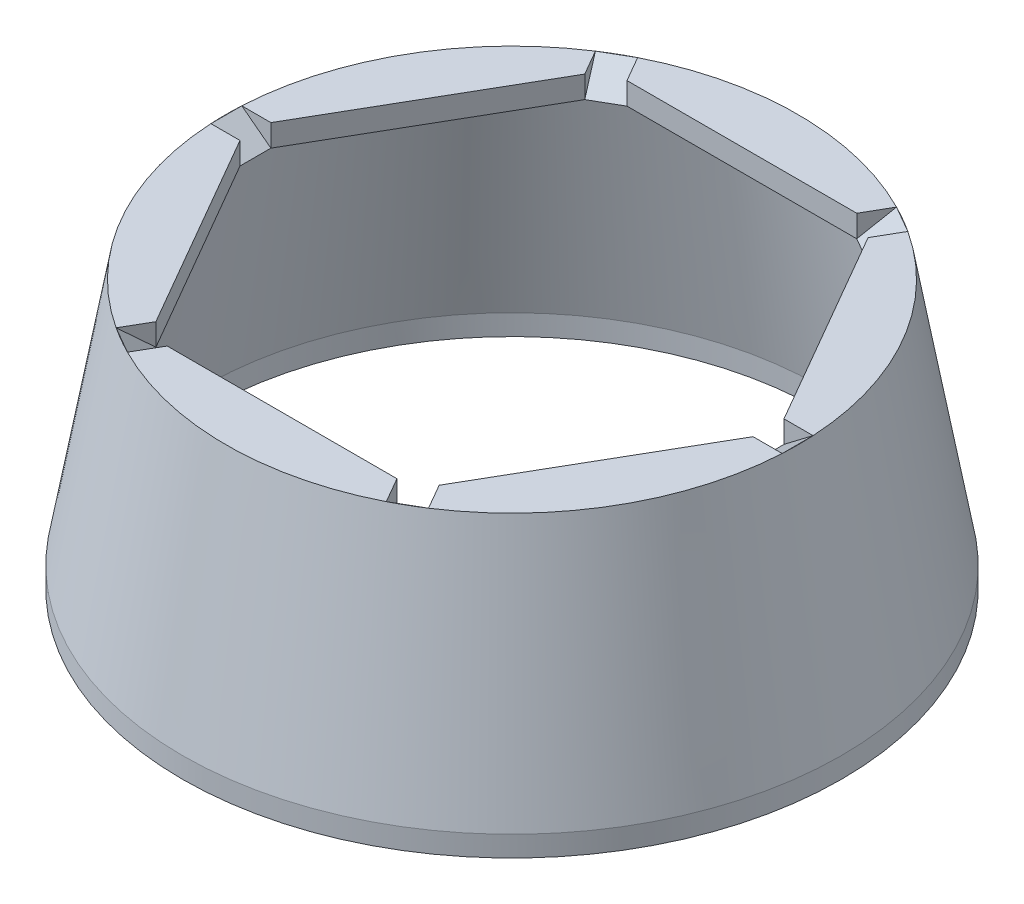
ISO-10303-21;
HEADER;
FILE_DESCRIPTION(('STEP AP214'),'2;1');
FILE_NAME('part.step','',(''),(''),'','','');
FILE_SCHEMA(('AUTOMOTIVE_DESIGN { 1 0 10303 214 1 1 1 1 }'));
ENDSEC;
DATA;
#1=APPLICATION_CONTEXT('core data for automotive mechanical design processes');
#2=APPLICATION_PROTOCOL_DEFINITION('international standard','automotive_design',2000,#1);
#3=PRODUCT_CONTEXT('',#1,'mechanical');
#4=PRODUCT('Part','Part','',(#3));
#5=PRODUCT_RELATED_PRODUCT_CATEGORY('part','',(#4));
#6=PRODUCT_DEFINITION_FORMATION('','',#4);
#7=PRODUCT_DEFINITION_CONTEXT('part definition',#1,'design');
#8=PRODUCT_DEFINITION('design','',#6,#7);
#9=PRODUCT_DEFINITION_SHAPE('','',#8);
#10=(LENGTH_UNIT() NAMED_UNIT(*) SI_UNIT(.MILLI.,.METRE.));
#11=(NAMED_UNIT(*) PLANE_ANGLE_UNIT() SI_UNIT($,.RADIAN.));
#12=(NAMED_UNIT(*) SI_UNIT($,.STERADIAN.) SOLID_ANGLE_UNIT());
#13=UNCERTAINTY_MEASURE_WITH_UNIT(LENGTH_MEASURE(1.E-05),#10,'distance_accuracy_value','');
#14=(GEOMETRIC_REPRESENTATION_CONTEXT(3) GLOBAL_UNCERTAINTY_ASSIGNED_CONTEXT((#13)) GLOBAL_UNIT_ASSIGNED_CONTEXT((#10,
#11,#12)) REPRESENTATION_CONTEXT('',''));
#15=CARTESIAN_POINT('',(0.,0.,0.));
#16=DIRECTION('',(0.,0.,1.));
#17=DIRECTION('',(1.,0.,0.));
#18=AXIS2_PLACEMENT_3D('',#15,#16,#17);
#19=CARTESIAN_POINT('',(0.,650.,0.));
#20=DIRECTION('',(0.,1.,0.));
#21=DIRECTION('',(0.,0.,1.));
#22=AXIS2_PLACEMENT_3D('',#19,#20,#21);
#23=PLANE('',#22);
#24=DIRECTION('',(-0.500000000000168,0.,0.866025403784341));
#25=VECTOR('',#24,1.);
#26=CARTESIAN_POINT('',(314.119157683228,650.,-619.070340738049));
#27=LINE('',#26,#25);
#28=CARTESIAN_POINT('',(314.119157683228,650.,-619.070340738049));
#29=VERTEX_POINT('',#28);
#30=CARTESIAN_POINT('',(278.80063559818,650.,-557.89686603853));
#31=VERTEX_POINT('',#30);
#32=EDGE_CURVE('E522',#29,#31,#27,.T.);
#33=ORIENTED_EDGE('',*,*,#32,.F.);
#34=CARTESIAN_POINT('',(0.,650.,0.));
#35=DIRECTION('',(0.,-1.,0.));
#36=DIRECTION('',(0.,0.,-1.));
#37=AXIS2_PLACEMENT_3D('',#34,#35,#36);
#38=CIRCLE('',#37,694.203811574919);
#39=CARTESIAN_POINT('',(-314.119157683214,650.,-619.070340738056));
#40=VERTEX_POINT('',#39);
#41=EDGE_CURVE('E543',#40,#29,#38,.T.);
#42=ORIENTED_EDGE('',*,*,#41,.F.);
#43=DIRECTION('',(-0.499999999999992,0.,-0.866025403784443));
#44=VECTOR('',#43,1.);
#45=CARTESIAN_POINT('',(-278.800635598174,650.,-557.896866038521));
#46=LINE('',#45,#44);
#47=CARTESIAN_POINT('',(-278.800635598174,650.,-557.896866038521));
#48=VERTEX_POINT('',#47);
#49=EDGE_CURVE('E512',#48,#40,#46,.T.);
#50=ORIENTED_EDGE('',*,*,#49,.F.);
#51=DIRECTION('',(-1.,0.,0.));
#52=VECTOR('',#51,1.);
#53=CARTESIAN_POINT('',(278.800635598174,650.,-557.896866038534));
#54=LINE('',#53,#52);
#55=EDGE_CURVE('E454',#31,#48,#54,.T.);
#56=ORIENTED_EDGE('',*,*,#55,.F.);
#57=EDGE_LOOP('',(#33,#42,#50,#56));
#58=FACE_BOUND('',#57,.T.);
#59=ADVANCED_FACE('F36',(#58),#23,.T.);
#60=DIRECTION('',(-0.866025403784433,0.,-0.50000000000001));
#61=VECTOR('',#60,1.);
#62=CARTESIAN_POINT('',(379.071062967039,650.,-581.570340738061));
#63=LINE('',#62,#61);
#64=CARTESIAN_POINT('',(379.071062967039,650.,-581.570340738061));
#65=VERTEX_POINT('',#64);
#66=EDGE_CURVE('E526',#65,#29,#63,.T.);
#67=ORIENTED_EDGE('',*,*,#66,.F.);
#68=EDGE_CURVE('E538',#29,#65,#38,.T.);
#69=ORIENTED_EDGE('',*,*,#68,.F.);
#70=EDGE_LOOP('',(#67,#69));
#71=FACE_BOUND('',#70,.T.);
#72=ADVANCED_FACE('F269',(#71),#23,.T.);
#73=DIRECTION('',(0.499999999999834,0.,0.866025403784535));
#74=VECTOR('',#73,1.);
#75=CARTESIAN_POINT('',(-379.071062967026,650.,-581.570340738069));
#76=LINE('',#75,#74);
#77=CARTESIAN_POINT('',(-379.071062967026,650.,-581.570340738069));
#78=VERTEX_POINT('',#77);
#79=CARTESIAN_POINT('',(-343.752540882002,650.,-520.396866038537));
#80=VERTEX_POINT('',#79);
#81=EDGE_CURVE('E494',#78,#80,#76,.T.);
#82=ORIENTED_EDGE('',*,*,#81,.F.);
#83=CARTESIAN_POINT('',(-693.190220650253,650.,-37.4999999999885));
#84=VERTEX_POINT('',#83);
#85=EDGE_CURVE('E499',#84,#78,#38,.T.);
#86=ORIENTED_EDGE('',*,*,#85,.F.);
#87=DIRECTION('',(-1.,0.,0.));
#88=VECTOR('',#87,1.);
#89=CARTESIAN_POINT('',(-622.55317648017,650.,-37.4999999999885));
#90=LINE('',#89,#88);
#91=CARTESIAN_POINT('',(-622.55317648017,650.,-37.4999999999885));
#92=VERTEX_POINT('',#91);
#93=EDGE_CURVE('E497',#92,#84,#90,.T.);
#94=ORIENTED_EDGE('',*,*,#93,.F.);
#95=DIRECTION('',(-0.499999999999976,0.,0.866025403784452));
#96=VECTOR('',#95,1.);
#97=CARTESIAN_POINT('',(-343.752540882008,650.,-520.396866038533));
#98=LINE('',#97,#96);
#99=EDGE_CURVE('E199',#80,#92,#98,.T.);
#100=ORIENTED_EDGE('',*,*,#99,.F.);
#101=EDGE_LOOP('',(#82,#86,#94,#100));
#102=FACE_BOUND('',#101,.T.);
#103=ADVANCED_FACE('F274',(#102),#23,.T.);
#104=DIRECTION('',(-0.866025403784443,0.,0.499999999999992));
#105=VECTOR('',#104,1.);
#106=CARTESIAN_POINT('',(-314.119157683214,650.,-619.070340738056));
#107=LINE('',#106,#105);
#108=EDGE_CURVE('E516',#40,#78,#107,.T.);
#109=ORIENTED_EDGE('',*,*,#108,.F.);
#110=EDGE_CURVE('E544',#78,#40,#38,.T.);
#111=ORIENTED_EDGE('',*,*,#110,.F.);
#112=EDGE_LOOP('',(#109,#111));
#113=FACE_BOUND('',#112,.T.);
#114=ADVANCED_FACE('F558',(#113),#23,.T.);
#115=DIRECTION('',(1.,0.,1.82713515449388E-13));
#116=VECTOR('',#115,1.);
#117=CARTESIAN_POINT('',(-693.190220650253,650.,37.4999999999874));
#118=LINE('',#117,#116);
#119=CARTESIAN_POINT('',(-693.190220650253,650.,37.4999999999874));
#120=VERTEX_POINT('',#119);
#121=CARTESIAN_POINT('',(-622.553176480181,650.,37.5000000000003));
#122=VERTEX_POINT('',#121);
#123=EDGE_CURVE('E413',#120,#122,#118,.T.);
#124=ORIENTED_EDGE('',*,*,#123,.F.);
#125=CARTESIAN_POINT('',(-379.071062967036,650.,581.570340738063));
#126=VERTEX_POINT('',#125);
#127=EDGE_CURVE('E411',#126,#120,#38,.T.);
#128=ORIENTED_EDGE('',*,*,#127,.F.);
#129=DIRECTION('',(-0.500000000000004,0.,0.866025403784436));
#130=VECTOR('',#129,1.);
#131=CARTESIAN_POINT('',(-343.752540881994,650.,520.396866038529));
#132=LINE('',#131,#130);
#133=CARTESIAN_POINT('',(-343.752540881994,650.,520.396866038529));
#134=VERTEX_POINT('',#133);
#135=EDGE_CURVE('E173',#134,#126,#132,.T.);
#136=ORIENTED_EDGE('',*,*,#135,.F.);
#137=DIRECTION('',(0.500000000000005,0.,0.866025403784436));
#138=VECTOR('',#137,1.);
#139=CARTESIAN_POINT('',(-622.55317648016,650.,37.4999999999886));
#140=LINE('',#139,#138);
#141=EDGE_CURVE('E193',#122,#134,#140,.T.);
#142=ORIENTED_EDGE('',*,*,#141,.F.);
#143=EDGE_LOOP('',(#124,#128,#136,#142));
#144=FACE_BOUND('',#143,.T.);
#145=ADVANCED_FACE('F412',(#144),#23,.T.);
#146=DIRECTION('',(0.,0.,1.));
#147=VECTOR('',#146,1.);
#148=CARTESIAN_POINT('',(-693.190220650253,650.,-37.4999999999885));
#149=LINE('',#148,#147);
#150=EDGE_CURVE('E501',#84,#120,#149,.T.);
#151=ORIENTED_EDGE('',*,*,#150,.F.);
#152=EDGE_CURVE('E416',#120,#84,#38,.T.);
#153=ORIENTED_EDGE('',*,*,#152,.F.);
#154=EDGE_LOOP('',(#151,#153));
#155=FACE_BOUND('',#154,.T.);
#156=ADVANCED_FACE('F546',(#155),#23,.T.);
#157=DIRECTION('',(0.500000000000162,0.,-0.866025403784345));
#158=VECTOR('',#157,1.);
#159=CARTESIAN_POINT('',(-314.119157683224,650.,619.070340738051));
#160=LINE('',#159,#158);
#161=CARTESIAN_POINT('',(-314.119157683224,650.,619.070340738051));
#162=VERTEX_POINT('',#161);
#163=CARTESIAN_POINT('',(-278.800635598176,650.,557.896866038533));
#164=VERTEX_POINT('',#163);
#165=EDGE_CURVE('E162',#162,#164,#160,.T.);
#166=ORIENTED_EDGE('',*,*,#165,.F.);
#167=CARTESIAN_POINT('',(314.119157683218,650.,619.070340738054));
#168=VERTEX_POINT('',#167);
#169=EDGE_CURVE('E419',#168,#162,#38,.T.);
#170=ORIENTED_EDGE('',*,*,#169,.F.);
#171=DIRECTION('',(0.499999999999998,0.,0.86602540378444));
#172=VECTOR('',#171,1.);
#173=CARTESIAN_POINT('',(278.800635598178,650.,557.896866038519));
#174=LINE('',#173,#172);
#175=CARTESIAN_POINT('',(278.800635598178,650.,557.896866038519));
#176=VERTEX_POINT('',#175);
#177=EDGE_CURVE('E191',#176,#168,#174,.T.);
#178=ORIENTED_EDGE('',*,*,#177,.F.);
#179=DIRECTION('',(1.,0.,0.));
#180=VECTOR('',#179,1.);
#181=CARTESIAN_POINT('',(-278.800635598159,650.,557.89686603851));
#182=LINE('',#181,#180);
#183=EDGE_CURVE('E181',#164,#176,#182,.T.);
#184=ORIENTED_EDGE('',*,*,#183,.F.);
#185=EDGE_LOOP('',(#166,#170,#178,#184));
#186=FACE_BOUND('',#185,.T.);
#187=ADVANCED_FACE('F189',(#186),#23,.T.);
#188=DIRECTION('',(0.866025403784436,0.,0.500000000000004));
#189=VECTOR('',#188,1.);
#190=CARTESIAN_POINT('',(-379.071062967036,650.,581.570340738063));
#191=LINE('',#190,#189);
#192=EDGE_CURVE('E394',#126,#162,#191,.T.);
#193=ORIENTED_EDGE('',*,*,#192,.F.);
#194=EDGE_CURVE('E406',#162,#126,#38,.T.);
#195=ORIENTED_EDGE('',*,*,#194,.F.);
#196=EDGE_LOOP('',(#193,#195));
#197=FACE_BOUND('',#196,.T.);
#198=ADVANCED_FACE('F404',(#197),#23,.T.);
#199=DIRECTION('',(-0.49999999999984,0.,-0.866025403784531));
#200=VECTOR('',#199,1.);
#201=CARTESIAN_POINT('',(379.07106296703,650.,581.570340738066));
#202=LINE('',#201,#200);
#203=CARTESIAN_POINT('',(379.07106296703,650.,581.570340738066));
#204=VERTEX_POINT('',#203);
#205=CARTESIAN_POINT('',(343.752540882006,650.,520.396866038534));
#206=VERTEX_POINT('',#205);
#207=EDGE_CURVE('E431',#204,#206,#202,.T.);
#208=ORIENTED_EDGE('',*,*,#207,.F.);
#209=CARTESIAN_POINT('',(693.190220650253,650.,37.4999999999885));
#210=VERTEX_POINT('',#209);
#211=EDGE_CURVE('E240',#210,#204,#38,.T.);
#212=ORIENTED_EDGE('',*,*,#211,.F.);
#213=DIRECTION('',(1.,0.,0.));
#214=VECTOR('',#213,1.);
#215=CARTESIAN_POINT('',(622.55317648017,650.,37.4999999999885));
#216=LINE('',#215,#214);
#217=CARTESIAN_POINT('',(622.55317648017,650.,37.4999999999885));
#218=VERTEX_POINT('',#217);
#219=EDGE_CURVE('E430',#218,#210,#216,.T.);
#220=ORIENTED_EDGE('',*,*,#219,.F.);
#221=DIRECTION('',(0.499999999999995,0.,-0.866025403784441));
#222=VECTOR('',#221,1.);
#223=CARTESIAN_POINT('',(343.752540882008,650.,520.396866038509));
#224=LINE('',#223,#222);
#225=EDGE_CURVE('E192',#206,#218,#224,.T.);
#226=ORIENTED_EDGE('',*,*,#225,.F.);
#227=EDGE_LOOP('',(#208,#212,#220,#226));
#228=FACE_BOUND('',#227,.T.);
#229=ADVANCED_FACE('F428',(#228),#23,.T.);
#230=DIRECTION('',(0.86602540378444,0.,-0.499999999999998));
#231=VECTOR('',#230,1.);
#232=CARTESIAN_POINT('',(314.119157683218,650.,619.070340738054));
#233=LINE('',#232,#231);
#234=EDGE_CURVE('E436',#168,#204,#233,.T.);
#235=ORIENTED_EDGE('',*,*,#234,.F.);
#236=EDGE_CURVE('E420',#204,#168,#38,.T.);
#237=ORIENTED_EDGE('',*,*,#236,.F.);
#238=EDGE_LOOP('',(#235,#237));
#239=FACE_BOUND('',#238,.T.);
#240=ADVANCED_FACE('F284',(#239),#23,.T.);
#241=DIRECTION('',(0.50000000000001,0.,-0.866025403784433));
#242=VECTOR('',#241,1.);
#243=CARTESIAN_POINT('',(343.752540881998,650.,-520.396866038526));
#244=LINE('',#243,#242);
#245=CARTESIAN_POINT('',(343.752540881998,650.,-520.396866038526));
#246=VERTEX_POINT('',#245);
#247=EDGE_CURVE('E524',#246,#65,#244,.T.);
#248=ORIENTED_EDGE('',*,*,#247,.F.);
#249=DIRECTION('',(-0.5,0.,-0.866025403784439));
#250=VECTOR('',#249,1.);
#251=CARTESIAN_POINT('',(622.553176480181,650.,-37.5000000000003));
#252=LINE('',#251,#250);
#253=CARTESIAN_POINT('',(622.553176480181,650.,-37.5000000000003));
#254=VERTEX_POINT('',#253);
#255=EDGE_CURVE('E196',#254,#246,#252,.T.);
#256=ORIENTED_EDGE('',*,*,#255,.F.);
#257=DIRECTION('',(-1.,0.,-1.82713515449388E-13));
#258=VECTOR('',#257,1.);
#259=CARTESIAN_POINT('',(693.190220650253,650.,-37.4999999999874));
#260=LINE('',#259,#258);
#261=CARTESIAN_POINT('',(693.190220650253,650.,-37.4999999999874));
#262=VERTEX_POINT('',#261);
#263=EDGE_CURVE('E444',#262,#254,#260,.T.);
#264=ORIENTED_EDGE('',*,*,#263,.F.);
#265=EDGE_CURVE('E235',#65,#262,#38,.T.);
#266=ORIENTED_EDGE('',*,*,#265,.F.);
#267=EDGE_LOOP('',(#248,#256,#264,#266));
#268=FACE_BOUND('',#267,.T.);
#269=ADVANCED_FACE('F264',(#268),#23,.T.);
#270=CARTESIAN_POINT('',(0.,650.,0.));
#271=DIRECTION('',(0.,-1.,0.));
#272=DIRECTION('',(0.,0.,-1.));
#273=AXIS2_PLACEMENT_3D('',#270,#271,#272);
#274=CONICAL_SURFACE('',#273,644.203811574919,0.174532925199437);
#275=CARTESIAN_POINT('',(0.,50.,0.));
#276=DIRECTION('',(0.,-1.,0.));
#277=DIRECTION('',(0.,0.,-1.));
#278=AXIS2_PLACEMENT_3D('',#275,#276,#277);
#279=CIRCLE('',#278,750.);
#280=CARTESIAN_POINT('',(0.,50.,-750.));
#281=VERTEX_POINT('',#280);
#282=EDGE_CURVE('E232',#281,#281,#279,.T.);
#283=ORIENTED_EDGE('',*,*,#282,.T.);
#284=EDGE_LOOP('',(#283));
#285=FACE_BOUND('',#284,.T.);
#286=CARTESIAN_POINT('',(0.,596.305798,0.));
#287=DIRECTION('',(0.,1.,0.));
#288=DIRECTION('',(0.,0.,1.));
#289=AXIS2_PLACEMENT_3D('',#286,#287,#288);
#290=CIRCLE('',#289,653.671548095129);
#291=CARTESIAN_POINT('',(0.,596.305798,653.671548095129));
#292=VERTEX_POINT('',#291);
#293=EDGE_CURVE('E40',#292,#292,#290,.T.);
#294=ORIENTED_EDGE('',*,*,#293,.T.);
#295=EDGE_LOOP('',(#294));
#296=FACE_BOUND('',#295,.T.);
#297=ADVANCED_FACE('F249',(#285,#296),#274,.F.);
#298=CARTESIAN_POINT('',(0.,0.,0.));
#299=DIRECTION('',(0.,1.,0.));
#300=DIRECTION('',(0.,0.,1.));
#301=AXIS2_PLACEMENT_3D('',#298,#299,#300);
#302=PLANE('',#301);
#303=CARTESIAN_POINT('',(0.,0.,0.));
#304=DIRECTION('',(0.,1.,0.));
#305=DIRECTION('',(0.,0.,1.));
#306=AXIS2_PLACEMENT_3D('',#303,#304,#305);
#307=CIRCLE('',#306,800.);
#308=CARTESIAN_POINT('',(0.,0.,800.));
#309=VERTEX_POINT('',#308);
#310=EDGE_CURVE('E45',#309,#309,#307,.T.);
#311=ORIENTED_EDGE('',*,*,#310,.F.);
#312=EDGE_LOOP('',(#311));
#313=FACE_BOUND('',#312,.T.);
#314=CARTESIAN_POINT('',(0.,0.,0.));
#315=DIRECTION('',(0.,1.,0.));
#316=DIRECTION('',(0.,0.,1.));
#317=AXIS2_PLACEMENT_3D('',#314,#315,#316);
#318=CIRCLE('',#317,750.);
#319=CARTESIAN_POINT('',(0.,0.,750.));
#320=VERTEX_POINT('',#319);
#321=EDGE_CURVE('E239',#320,#320,#318,.T.);
#322=ORIENTED_EDGE('',*,*,#321,.T.);
#323=EDGE_LOOP('',(#322));
#324=FACE_BOUND('',#323,.T.);
#325=ADVANCED_FACE('F246',(#313,#324),#302,.F.);
#326=CARTESIAN_POINT('',(0.,50.,0.));
#327=DIRECTION('',(0.,-1.,0.));
#328=DIRECTION('',(0.,0.,-1.));
#329=AXIS2_PLACEMENT_3D('',#326,#327,#328);
#330=CYLINDRICAL_SURFACE('',#329,800.);
#331=CARTESIAN_POINT('',(0.,50.,0.));
#332=DIRECTION('',(0.,1.,0.));
#333=DIRECTION('',(0.,0.,1.));
#334=AXIS2_PLACEMENT_3D('',#331,#332,#333);
#335=CIRCLE('',#334,800.);
#336=CARTESIAN_POINT('',(0.,50.,800.));
#337=VERTEX_POINT('',#336);
#338=EDGE_CURVE('E11',#337,#337,#335,.T.);
#339=ORIENTED_EDGE('',*,*,#338,.F.);
#340=EDGE_LOOP('',(#339));
#341=FACE_BOUND('',#340,.T.);
#342=ORIENTED_EDGE('',*,*,#310,.T.);
#343=EDGE_LOOP('',(#342));
#344=FACE_BOUND('',#343,.T.);
#345=ADVANCED_FACE('F38',(#341,#344),#330,.T.);
#346=CARTESIAN_POINT('',(0.,50.,0.));
#347=DIRECTION('',(0.,-1.,0.));
#348=DIRECTION('',(0.,0.,-1.));
#349=AXIS2_PLACEMENT_3D('',#346,#347,#348);
#350=CYLINDRICAL_SURFACE('',#349,750.);
#351=ORIENTED_EDGE('',*,*,#282,.F.);
#352=EDGE_LOOP('',(#351));
#353=FACE_BOUND('',#352,.T.);
#354=ORIENTED_EDGE('',*,*,#321,.F.);
#355=EDGE_LOOP('',(#354));
#356=FACE_BOUND('',#355,.T.);
#357=ADVANCED_FACE('F252',(#353,#356),#350,.F.);
#358=DIRECTION('',(0.,0.,-1.));
#359=VECTOR('',#358,1.);
#360=CARTESIAN_POINT('',(693.190220650253,650.,37.4999999999885));
#361=LINE('',#360,#359);
#362=EDGE_CURVE('E448',#210,#262,#361,.T.);
#363=ORIENTED_EDGE('',*,*,#362,.F.);
#364=EDGE_CURVE('E236',#262,#210,#38,.T.);
#365=ORIENTED_EDGE('',*,*,#364,.F.);
#366=EDGE_LOOP('',(#363,#365));
#367=FACE_BOUND('',#366,.T.);
#368=ADVANCED_FACE('F254',(#367),#23,.T.);
#369=CARTESIAN_POINT('',(0.,50.,0.));
#370=DIRECTION('',(0.,-1.,0.));
#371=DIRECTION('',(0.,0.,-1.));
#372=AXIS2_PLACEMENT_3D('',#369,#370,#371);
#373=CONICAL_SURFACE('',#372,800.,0.174532925199437);
#374=ORIENTED_EDGE('',*,*,#364,.T.);
#375=ORIENTED_EDGE('',*,*,#211,.T.);
#376=ORIENTED_EDGE('',*,*,#236,.T.);
#377=ORIENTED_EDGE('',*,*,#169,.T.);
#378=ORIENTED_EDGE('',*,*,#194,.T.);
#379=ORIENTED_EDGE('',*,*,#127,.T.);
#380=ORIENTED_EDGE('',*,*,#152,.T.);
#381=ORIENTED_EDGE('',*,*,#85,.T.);
#382=ORIENTED_EDGE('',*,*,#110,.T.);
#383=ORIENTED_EDGE('',*,*,#41,.T.);
#384=ORIENTED_EDGE('',*,*,#68,.T.);
#385=ORIENTED_EDGE('',*,*,#265,.T.);
#386=EDGE_LOOP('',(#374,#375,#376,#377,#378,#379,#380,#381,#382,#383,#384,#385));
#387=FACE_BOUND('',#386,.T.);
#388=ORIENTED_EDGE('',*,*,#338,.T.);
#389=EDGE_LOOP('',(#388));
#390=FACE_BOUND('',#389,.T.);
#391=ADVANCED_FACE('F261',(#387,#390),#373,.T.);
#392=CARTESIAN_POINT('',(0.,596.305798,0.));
#393=DIRECTION('',(0.,1.,0.));
#394=DIRECTION('',(0.,0.,1.));
#395=AXIS2_PLACEMENT_3D('',#392,#393,#394);
#396=PLANE('',#395);
#397=DIRECTION('',(-0.866025403784439,0.,-0.499999999999999));
#398=VECTOR('',#397,1.);
#399=CARTESIAN_POINT('',(278.800635598174,596.305798,-557.896866038534));
#400=LINE('',#399,#398);
#401=CARTESIAN_POINT('',(343.752540882007,596.305798,-520.396866038533));
#402=VERTEX_POINT('',#401);
#403=CARTESIAN_POINT('',(278.800635598191,596.305798132989,-557.896866038524));
#404=VERTEX_POINT('',#403);
#405=EDGE_CURVE('E231',#402,#404,#400,.T.);
#406=ORIENTED_EDGE('',*,*,#405,.T.);
#407=DIRECTION('',(-1.,0.,0.));
#408=VECTOR('',#407,1.);
#409=CARTESIAN_POINT('',(278.800635598174,596.305798,-557.896866038534));
#410=LINE('',#409,#408);
#411=CARTESIAN_POINT('',(-278.800635598158,596.305798,-557.89686603853));
#412=VERTEX_POINT('',#411);
#413=EDGE_CURVE('E205',#404,#412,#410,.T.);
#414=ORIENTED_EDGE('',*,*,#413,.T.);
#415=DIRECTION('',(-0.866025403784509,0.,0.499999999999878));
#416=VECTOR('',#415,1.);
#417=CARTESIAN_POINT('',(-343.752540882008,596.305798,-520.396866038533));
#418=LINE('',#417,#416);
#419=CARTESIAN_POINT('',(-343.752540881991,596.305798132989,-520.396866038543));
#420=VERTEX_POINT('',#419);
#421=EDGE_CURVE('E458',#412,#420,#418,.T.);
#422=ORIENTED_EDGE('',*,*,#421,.T.);
#423=DIRECTION('',(-0.499999999999976,0.,0.866025403784452));
#424=VECTOR('',#423,1.);
#425=CARTESIAN_POINT('',(-343.752540882008,596.305798,-520.396866038533));
#426=LINE('',#425,#424);
#427=CARTESIAN_POINT('',(-622.553176480156,596.305798,-37.5000000000125));
#428=VERTEX_POINT('',#427);
#429=EDGE_CURVE('E461',#420,#428,#426,.T.);
#430=ORIENTED_EDGE('',*,*,#429,.T.);
#431=DIRECTION('',(0.,0.,1.));
#432=VECTOR('',#431,1.);
#433=CARTESIAN_POINT('',(-622.55317648016,596.305798,37.4999999999886));
#434=LINE('',#433,#432);
#435=CARTESIAN_POINT('',(-622.553176480158,596.305798132972,37.4999999999874));
#436=VERTEX_POINT('',#435);
#437=EDGE_CURVE('E464',#428,#436,#434,.T.);
#438=ORIENTED_EDGE('',*,*,#437,.T.);
#439=DIRECTION('',(0.500000000000005,0.,0.866025403784436));
#440=VECTOR('',#439,1.);
#441=CARTESIAN_POINT('',(-622.55317648016,596.305798,37.4999999999886));
#442=LINE('',#441,#440);
#443=CARTESIAN_POINT('',(-343.752540881992,596.305798,520.396866038506));
#444=VERTEX_POINT('',#443);
#445=EDGE_CURVE('E467',#436,#444,#442,.T.);
#446=ORIENTED_EDGE('',*,*,#445,.T.);
#447=DIRECTION('',(0.866025403784416,0.,0.50000000000004));
#448=VECTOR('',#447,1.);
#449=CARTESIAN_POINT('',(-278.800635598159,596.305798,557.89686603851));
#450=LINE('',#449,#448);
#451=CARTESIAN_POINT('',(-278.800635598173,596.305798132968,557.896866038502));
#452=VERTEX_POINT('',#451);
#453=EDGE_CURVE('E395',#444,#452,#450,.T.);
#454=ORIENTED_EDGE('',*,*,#453,.T.);
#455=DIRECTION('',(1.,0.,0.));
#456=VECTOR('',#455,1.);
#457=CARTESIAN_POINT('',(-278.800635598159,596.305798,557.89686603851));
#458=LINE('',#457,#456);
#459=CARTESIAN_POINT('',(278.800635598172,596.305798,557.896866038507));
#460=VERTEX_POINT('',#459);
#461=EDGE_CURVE('E183',#452,#460,#458,.T.);
#462=ORIENTED_EDGE('',*,*,#461,.T.);
#463=DIRECTION('',(0.866025403784462,0.,-0.49999999999996));
#464=VECTOR('',#463,1.);
#465=CARTESIAN_POINT('',(343.752540882008,596.305798,520.396866038509));
#466=LINE('',#465,#464);
#467=CARTESIAN_POINT('',(343.752540881984,596.305798132974,520.396866038522));
#468=VERTEX_POINT('',#467);
#469=EDGE_CURVE('E472',#460,#468,#466,.T.);
#470=ORIENTED_EDGE('',*,*,#469,.T.);
#471=DIRECTION('',(0.499999999999995,0.,-0.866025403784441));
#472=VECTOR('',#471,1.);
#473=CARTESIAN_POINT('',(343.752540882008,596.305798,520.396866038509));
#474=LINE('',#473,#472);
#475=CARTESIAN_POINT('',(622.55317648017,596.305798,37.4999999999885));
#476=VERTEX_POINT('',#475);
#477=EDGE_CURVE('E475',#468,#476,#474,.T.);
#478=ORIENTED_EDGE('',*,*,#477,.T.);
#479=DIRECTION('',(1.40628249785874E-13,0.,-1.));
#480=VECTOR('',#479,1.);
#481=CARTESIAN_POINT('',(622.553176480181,596.305798,-37.5000000000003));
#482=LINE('',#481,#480);
#483=CARTESIAN_POINT('',(622.553176480176,596.305798132986,-37.4999999999874));
#484=VERTEX_POINT('',#483);
#485=EDGE_CURVE('E478',#476,#484,#482,.T.);
#486=ORIENTED_EDGE('',*,*,#485,.T.);
#487=DIRECTION('',(-0.5,0.,-0.866025403784439));
#488=VECTOR('',#487,1.);
#489=CARTESIAN_POINT('',(622.553176480181,596.305798,-37.5000000000003));
#490=LINE('',#489,#488);
#491=EDGE_CURVE('E481',#484,#402,#490,.T.);
#492=ORIENTED_EDGE('',*,*,#491,.T.);
#493=EDGE_LOOP('',(#406,#414,#422,#430,#438,#446,#454,#462,#470,#478,#486,#492));
#494=FACE_BOUND('',#493,.T.);
#495=ORIENTED_EDGE('',*,*,#293,.F.);
#496=EDGE_LOOP('',(#495));
#497=FACE_BOUND('',#496,.T.);
#498=ADVANCED_FACE('F290',(#494,#497),#396,.F.);
#499=CARTESIAN_POINT('',(278.800635598174,596.305798,-557.896866038534));
#500=DIRECTION('',(0.,0.,-1.));
#501=DIRECTION('',(-1.,0.,0.));
#502=AXIS2_PLACEMENT_3D('',#499,#500,#501);
#503=PLANE('',#502);
#504=ORIENTED_EDGE('',*,*,#55,.T.);
#505=DIRECTION('',(0.,1.,0.));
#506=VECTOR('',#505,1.);
#507=CARTESIAN_POINT('',(-278.800635598158,596.305798,-557.89686603853));
#508=LINE('',#507,#506);
#509=EDGE_CURVE('E229',#412,#48,#508,.T.);
#510=ORIENTED_EDGE('',*,*,#509,.F.);
#511=ORIENTED_EDGE('',*,*,#413,.F.);
#512=DIRECTION('',(0.,1.,0.));
#513=VECTOR('',#512,1.);
#514=CARTESIAN_POINT('',(278.800635598174,596.305798,-557.896866038534));
#515=LINE('',#514,#513);
#516=EDGE_CURVE('E206',#404,#31,#515,.T.);
#517=ORIENTED_EDGE('',*,*,#516,.T.);
#518=EDGE_LOOP('',(#504,#510,#511,#517));
#519=FACE_BOUND('',#518,.T.);
#520=ADVANCED_FACE('F292',(#519),#503,.F.);
#521=CARTESIAN_POINT('',(622.553176480181,596.305798,-37.5000000000003));
#522=DIRECTION('',(0.866025403784439,0.,-0.5));
#523=DIRECTION('',(-0.5,0.,-0.866025403784439));
#524=AXIS2_PLACEMENT_3D('',#521,#522,#523);
#525=PLANE('',#524);
#526=ORIENTED_EDGE('',*,*,#255,.T.);
#527=DIRECTION('',(0.,1.,0.));
#528=VECTOR('',#527,1.);
#529=CARTESIAN_POINT('',(343.752540882007,596.305798,-520.396866038533));
#530=LINE('',#529,#528);
#531=EDGE_CURVE('E209',#402,#246,#530,.T.);
#532=ORIENTED_EDGE('',*,*,#531,.F.);
#533=ORIENTED_EDGE('',*,*,#491,.F.);
#534=DIRECTION('',(0.,1.,0.));
#535=VECTOR('',#534,1.);
#536=CARTESIAN_POINT('',(622.553176480181,596.305798,-37.5000000000003));
#537=LINE('',#536,#535);
#538=EDGE_CURVE('E211',#484,#254,#537,.T.);
#539=ORIENTED_EDGE('',*,*,#538,.T.);
#540=EDGE_LOOP('',(#526,#532,#533,#539));
#541=FACE_BOUND('',#540,.T.);
#542=ADVANCED_FACE('F298',(#541),#525,.F.);
#543=CARTESIAN_POINT('',(343.752540882008,596.305798,520.396866038509));
#544=DIRECTION('',(0.866025403784441,0.,0.499999999999995));
#545=DIRECTION('',(0.499999999999995,0.,-0.866025403784441));
#546=AXIS2_PLACEMENT_3D('',#543,#544,#545);
#547=PLANE('',#546);
#548=ORIENTED_EDGE('',*,*,#225,.T.);
#549=DIRECTION('',(0.,1.,0.));
#550=VECTOR('',#549,1.);
#551=CARTESIAN_POINT('',(622.55317648017,596.305798,37.4999999999885));
#552=LINE('',#551,#550);
#553=EDGE_CURVE('E214',#476,#218,#552,.T.);
#554=ORIENTED_EDGE('',*,*,#553,.F.);
#555=ORIENTED_EDGE('',*,*,#477,.F.);
#556=DIRECTION('',(0.,1.,0.));
#557=VECTOR('',#556,1.);
#558=CARTESIAN_POINT('',(343.752540882008,596.305798,520.396866038509));
#559=LINE('',#558,#557);
#560=EDGE_CURVE('E216',#468,#206,#559,.T.);
#561=ORIENTED_EDGE('',*,*,#560,.T.);
#562=EDGE_LOOP('',(#548,#554,#555,#561));
#563=FACE_BOUND('',#562,.T.);
#564=ADVANCED_FACE('F315',(#563),#547,.F.);
#565=CARTESIAN_POINT('',(-278.800635598159,596.305798,557.89686603851));
#566=DIRECTION('',(0.,0.,1.));
#567=DIRECTION('',(1.,0.,0.));
#568=AXIS2_PLACEMENT_3D('',#565,#566,#567);
#569=PLANE('',#568);
#570=ORIENTED_EDGE('',*,*,#183,.T.);
#571=DIRECTION('',(0.,1.,0.));
#572=VECTOR('',#571,1.);
#573=CARTESIAN_POINT('',(278.800635598172,596.305798,557.896866038507));
#574=LINE('',#573,#572);
#575=EDGE_CURVE('E185',#460,#176,#574,.T.);
#576=ORIENTED_EDGE('',*,*,#575,.F.);
#577=ORIENTED_EDGE('',*,*,#461,.F.);
#578=DIRECTION('',(0.,1.,0.));
#579=VECTOR('',#578,1.);
#580=CARTESIAN_POINT('',(-278.800635598159,596.305798,557.89686603851));
#581=LINE('',#580,#579);
#582=EDGE_CURVE('E165',#452,#164,#581,.T.);
#583=ORIENTED_EDGE('',*,*,#582,.T.);
#584=EDGE_LOOP('',(#570,#576,#577,#583));
#585=FACE_BOUND('',#584,.T.);
#586=ADVANCED_FACE('F179',(#585),#569,.F.);
#587=CARTESIAN_POINT('',(-622.55317648016,596.305798,37.4999999999886));
#588=DIRECTION('',(-0.866025403784436,0.,0.500000000000005));
#589=DIRECTION('',(0.500000000000005,0.,0.866025403784436));
#590=AXIS2_PLACEMENT_3D('',#587,#588,#589);
#591=PLANE('',#590);
#592=ORIENTED_EDGE('',*,*,#141,.T.);
#593=DIRECTION('',(0.,1.,0.));
#594=VECTOR('',#593,1.);
#595=CARTESIAN_POINT('',(-343.752540881992,596.305798,520.396866038506));
#596=LINE('',#595,#594);
#597=EDGE_CURVE('E186',#444,#134,#596,.T.);
#598=ORIENTED_EDGE('',*,*,#597,.F.);
#599=ORIENTED_EDGE('',*,*,#445,.F.);
#600=DIRECTION('',(0.,1.,0.));
#601=VECTOR('',#600,1.);
#602=CARTESIAN_POINT('',(-622.55317648016,596.305798,37.4999999999886));
#603=LINE('',#602,#601);
#604=EDGE_CURVE('E221',#436,#122,#603,.T.);
#605=ORIENTED_EDGE('',*,*,#604,.T.);
#606=EDGE_LOOP('',(#592,#598,#599,#605));
#607=FACE_BOUND('',#606,.T.);
#608=ADVANCED_FACE('F308',(#607),#591,.F.);
#609=CARTESIAN_POINT('',(-343.752540882008,596.305798,-520.396866038533));
#610=DIRECTION('',(-0.866025403784453,0.,-0.499999999999976));
#611=DIRECTION('',(-0.499999999999976,0.,0.866025403784453));
#612=AXIS2_PLACEMENT_3D('',#609,#610,#611);
#613=PLANE('',#612);
#614=ORIENTED_EDGE('',*,*,#99,.T.);
#615=DIRECTION('',(0.,1.,0.));
#616=VECTOR('',#615,1.);
#617=CARTESIAN_POINT('',(-622.553176480156,596.305798,-37.5000000000125));
#618=LINE('',#617,#616);
#619=EDGE_CURVE('E224',#428,#92,#618,.T.);
#620=ORIENTED_EDGE('',*,*,#619,.F.);
#621=ORIENTED_EDGE('',*,*,#429,.F.);
#622=DIRECTION('',(0.,1.,0.));
#623=VECTOR('',#622,1.);
#624=CARTESIAN_POINT('',(-343.752540882008,596.305798,-520.396866038533));
#625=LINE('',#624,#623);
#626=EDGE_CURVE('E226',#420,#80,#625,.T.);
#627=ORIENTED_EDGE('',*,*,#626,.T.);
#628=EDGE_LOOP('',(#614,#620,#621,#627));
#629=FACE_BOUND('',#628,.T.);
#630=ADVANCED_FACE('F304',(#629),#613,.F.);
#631=CARTESIAN_POINT('',(589.696228211971,571.329843465359,-37.4999999999874));
#632=DIRECTION('',(1.82713515449388E-13,-2.4036752968661E-13,-1.));
#633=DIRECTION('',(0.,1.,-2.4036752968661E-13));
#634=AXIS2_PLACEMENT_3D('',#631,#632,#633);
#635=PLANE('',#634);
#636=DIRECTION('',(0.796107634140624,0.605155050266473,0.));
#637=VECTOR('',#636,1.);
#638=CARTESIAN_POINT('',(589.696228211971,571.329843465359,-37.4999999999874));
#639=LINE('',#638,#637);
#640=EDGE_CURVE('E451',#484,#262,#639,.T.);
#641=ORIENTED_EDGE('',*,*,#640,.T.);
#642=ORIENTED_EDGE('',*,*,#263,.T.);
#643=ORIENTED_EDGE('',*,*,#538,.F.);
#644=EDGE_LOOP('',(#641,#642,#643));
#645=FACE_BOUND('',#644,.T.);
#646=ADVANCED_FACE('F307',(#645),#635,.F.);
#647=CARTESIAN_POINT('',(589.696228211971,571.329843465359,37.4999999999885));
#648=DIRECTION('',(0.605155050266473,-0.796107634140624,0.));
#649=DIRECTION('',(0.796107634140625,0.605155050266473,0.));
#650=AXIS2_PLACEMENT_3D('',#647,#648,#649);
#651=PLANE('',#650);
#652=DIRECTION('',(0.796107634140624,0.605155050266473,0.));
#653=VECTOR('',#652,1.);
#654=CARTESIAN_POINT('',(589.696228211971,571.329843465359,37.4999999999885));
#655=LINE('',#654,#653);
#656=EDGE_CURVE('E61',#476,#210,#655,.T.);
#657=ORIENTED_EDGE('',*,*,#656,.T.);
#658=ORIENTED_EDGE('',*,*,#362,.T.);
#659=ORIENTED_EDGE('',*,*,#640,.F.);
#660=ORIENTED_EDGE('',*,*,#485,.F.);
#661=EDGE_LOOP('',(#657,#658,#659,#660));
#662=FACE_BOUND('',#661,.T.);
#663=ADVANCED_FACE('F324',(#662),#651,.F.);
#664=CARTESIAN_POINT('',(519.059184041889,571.329843465359,37.4999999999885));
#665=DIRECTION('',(0.,0.,1.));
#666=DIRECTION('',(1.,0.,0.));
#667=AXIS2_PLACEMENT_3D('',#664,#665,#666);
#668=PLANE('',#667);
#669=ORIENTED_EDGE('',*,*,#219,.T.);
#670=ORIENTED_EDGE('',*,*,#656,.F.);
#671=ORIENTED_EDGE('',*,*,#553,.T.);
#672=EDGE_LOOP('',(#669,#670,#671));
#673=FACE_BOUND('',#672,.T.);
#674=ADVANCED_FACE('F326',(#673),#668,.F.);
#675=CARTESIAN_POINT('',(-327.324066747887,571.329843465359,-491.941914147442));
#676=DIRECTION('',(-0.866025403784535,-2.40439648467229E-13,0.499999999999834));
#677=DIRECTION('',(0.499999999999834,0.,0.866025403784535));
#678=AXIS2_PLACEMENT_3D('',#675,#676,#677);
#679=PLANE('',#678);
#680=DIRECTION('',(-0.398053817070306,0.605155050266473,-0.689449435312512));
#681=VECTOR('',#680,1.);
#682=CARTESIAN_POINT('',(-327.324066747887,571.329843465359,-491.941914147442));
#683=LINE('',#682,#681);
#684=EDGE_CURVE('E506',#420,#78,#683,.T.);
#685=ORIENTED_EDGE('',*,*,#684,.T.);
#686=ORIENTED_EDGE('',*,*,#81,.T.);
#687=ORIENTED_EDGE('',*,*,#626,.F.);
#688=EDGE_LOOP('',(#685,#686,#687));
#689=FACE_BOUND('',#688,.T.);
#690=ADVANCED_FACE('F329',(#689),#679,.F.);
#691=CARTESIAN_POINT('',(-262.372161464074,571.329843465359,-529.44191414743));
#692=DIRECTION('',(-0.302577525133232,-0.796107634140624,-0.524079646759218));
#693=DIRECTION('',(0.,0.549854184036211,-0.835260663684022));
#694=AXIS2_PLACEMENT_3D('',#691,#692,#693);
#695=PLANE('',#694);
#696=DIRECTION('',(-0.398053817070306,0.605155050266473,-0.689449435312512));
#697=VECTOR('',#696,1.);
#698=CARTESIAN_POINT('',(-262.372161464074,571.329843465359,-529.44191414743));
#699=LINE('',#698,#697);
#700=EDGE_CURVE('E519',#412,#40,#699,.T.);
#701=ORIENTED_EDGE('',*,*,#700,.T.);
#702=ORIENTED_EDGE('',*,*,#108,.T.);
#703=ORIENTED_EDGE('',*,*,#684,.F.);
#704=ORIENTED_EDGE('',*,*,#421,.F.);
#705=EDGE_LOOP('',(#701,#702,#703,#704));
#706=FACE_BOUND('',#705,.T.);
#707=ADVANCED_FACE('F359',(#706),#695,.F.);
#708=CARTESIAN_POINT('',(-227.053639379034,571.329843465359,-468.268439447895));
#709=DIRECTION('',(0.866025403784443,0.,-0.499999999999992));
#710=DIRECTION('',(-0.499999999999992,0.,-0.866025403784443));
#711=AXIS2_PLACEMENT_3D('',#708,#709,#710);
#712=PLANE('',#711);
#713=ORIENTED_EDGE('',*,*,#49,.T.);
#714=ORIENTED_EDGE('',*,*,#700,.F.);
#715=ORIENTED_EDGE('',*,*,#509,.T.);
#716=EDGE_LOOP('',(#713,#714,#715));
#717=FACE_BOUND('',#716,.T.);
#718=ADVANCED_FACE('F361',(#717),#712,.F.);
#719=CARTESIAN_POINT('',(-589.696228211971,571.329843465359,37.4999999999874));
#720=DIRECTION('',(-1.82713515449388E-13,-2.4036752968661E-13,1.));
#721=DIRECTION('',(0.,-1.,-2.4036752968661E-13));
#722=AXIS2_PLACEMENT_3D('',#719,#720,#721);
#723=PLANE('',#722);
#724=DIRECTION('',(-0.796107634140624,0.605155050266473,0.));
#725=VECTOR('',#724,1.);
#726=CARTESIAN_POINT('',(-589.696228211971,571.329843465359,37.4999999999874));
#727=LINE('',#726,#725);
#728=EDGE_CURVE('E174',#436,#120,#727,.T.);
#729=ORIENTED_EDGE('',*,*,#728,.T.);
#730=ORIENTED_EDGE('',*,*,#123,.T.);
#731=ORIENTED_EDGE('',*,*,#604,.F.);
#732=EDGE_LOOP('',(#729,#730,#731));
#733=FACE_BOUND('',#732,.T.);
#734=ADVANCED_FACE('F364',(#733),#723,.F.);
#735=CARTESIAN_POINT('',(-589.696228211971,571.329843465359,-37.4999999999885));
#736=DIRECTION('',(-0.605155050266473,-0.796107634140624,0.));
#737=DIRECTION('',(0.796107634140625,-0.605155050266473,0.));
#738=AXIS2_PLACEMENT_3D('',#735,#736,#737);
#739=PLANE('',#738);
#740=DIRECTION('',(-0.796107634140624,0.605155050266473,0.));
#741=VECTOR('',#740,1.);
#742=CARTESIAN_POINT('',(-589.696228211971,571.329843465359,-37.4999999999885));
#743=LINE('',#742,#741);
#744=EDGE_CURVE('E504',#428,#84,#743,.T.);
#745=ORIENTED_EDGE('',*,*,#744,.T.);
#746=ORIENTED_EDGE('',*,*,#150,.T.);
#747=ORIENTED_EDGE('',*,*,#728,.F.);
#748=ORIENTED_EDGE('',*,*,#437,.F.);
#749=EDGE_LOOP('',(#745,#746,#747,#748));
#750=FACE_BOUND('',#749,.T.);
#751=ADVANCED_FACE('F371',(#750),#739,.F.);
#752=CARTESIAN_POINT('',(-519.059184041889,571.329843465359,-37.4999999999885));
#753=DIRECTION('',(0.,0.,-1.));
#754=DIRECTION('',(-1.,0.,0.));
#755=AXIS2_PLACEMENT_3D('',#752,#753,#754);
#756=PLANE('',#755);
#757=ORIENTED_EDGE('',*,*,#93,.T.);
#758=ORIENTED_EDGE('',*,*,#744,.F.);
#759=ORIENTED_EDGE('',*,*,#619,.T.);
#760=EDGE_LOOP('',(#757,#758,#759));
#761=FACE_BOUND('',#760,.T.);
#762=ADVANCED_FACE('F373',(#761),#756,.F.);
#763=CARTESIAN_POINT('',(-262.372161464083,571.329843465359,529.441914147426));
#764=DIRECTION('',(0.866025403784345,-2.40527850832771E-13,0.500000000000162));
#765=DIRECTION('',(0.500000000000162,0.,-0.866025403784345));
#766=AXIS2_PLACEMENT_3D('',#763,#764,#765);
#767=PLANE('',#766);
#768=DIRECTION('',(-0.398053817070315,0.605155050266473,0.689449435312507));
#769=VECTOR('',#768,1.);
#770=CARTESIAN_POINT('',(-262.372161464083,571.329843465359,529.441914147426));
#771=LINE('',#770,#769);
#772=EDGE_CURVE('E167',#452,#162,#771,.T.);
#773=ORIENTED_EDGE('',*,*,#772,.T.);
#774=ORIENTED_EDGE('',*,*,#165,.T.);
#775=ORIENTED_EDGE('',*,*,#582,.F.);
#776=EDGE_LOOP('',(#773,#774,#775));
#777=FACE_BOUND('',#776,.T.);
#778=ADVANCED_FACE('F164',(#777),#767,.F.);
#779=CARTESIAN_POINT('',(-327.324066747895,571.329843465359,491.941914147437));
#780=DIRECTION('',(-0.302577525133239,-0.796107634140624,0.524079646759213));
#781=DIRECTION('',(0.,-0.549854184036208,-0.835260663684024));
#782=AXIS2_PLACEMENT_3D('',#779,#780,#781);
#783=PLANE('',#782);
#784=DIRECTION('',(-0.398053817070315,0.605155050266473,0.689449435312507));
#785=VECTOR('',#784,1.);
#786=CARTESIAN_POINT('',(-327.324066747895,571.329843465359,491.941914147437));
#787=LINE('',#786,#785);
#788=EDGE_CURVE('E391',#444,#126,#787,.T.);
#789=ORIENTED_EDGE('',*,*,#788,.T.);
#790=ORIENTED_EDGE('',*,*,#192,.T.);
#791=ORIENTED_EDGE('',*,*,#772,.F.);
#792=ORIENTED_EDGE('',*,*,#453,.F.);
#793=EDGE_LOOP('',(#789,#790,#791,#792));
#794=FACE_BOUND('',#793,.T.);
#795=ADVANCED_FACE('F382',(#794),#783,.F.);
#796=CARTESIAN_POINT('',(-292.005544662853,571.329843465359,430.768439447903));
#797=DIRECTION('',(-0.866025403784436,0.,-0.500000000000004));
#798=DIRECTION('',(-0.500000000000004,0.,0.866025403784436));
#799=AXIS2_PLACEMENT_3D('',#796,#797,#798);
#800=PLANE('',#799);
#801=ORIENTED_EDGE('',*,*,#135,.T.);
#802=ORIENTED_EDGE('',*,*,#788,.F.);
#803=ORIENTED_EDGE('',*,*,#597,.T.);
#804=EDGE_LOOP('',(#801,#802,#803));
#805=FACE_BOUND('',#804,.T.);
#806=ADVANCED_FACE('F337',(#805),#800,.F.);
#807=CARTESIAN_POINT('',(327.32406674789,571.329843465359,491.94191414744));
#808=DIRECTION('',(0.866025403784531,-2.40439648467229E-13,-0.49999999999984));
#809=DIRECTION('',(-0.49999999999984,0.,-0.866025403784531));
#810=AXIS2_PLACEMENT_3D('',#807,#808,#809);
#811=PLANE('',#810);
#812=DIRECTION('',(0.398053817070311,0.605155050266473,0.689449435312509));
#813=VECTOR('',#812,1.);
#814=CARTESIAN_POINT('',(327.32406674789,571.329843465359,491.94191414744));
#815=LINE('',#814,#813);
#816=EDGE_CURVE('E440',#468,#204,#815,.T.);
#817=ORIENTED_EDGE('',*,*,#816,.T.);
#818=ORIENTED_EDGE('',*,*,#207,.T.);
#819=ORIENTED_EDGE('',*,*,#560,.F.);
#820=EDGE_LOOP('',(#817,#818,#819));
#821=FACE_BOUND('',#820,.T.);
#822=ADVANCED_FACE('F333',(#821),#811,.F.);
#823=CARTESIAN_POINT('',(262.372161464078,571.329843465359,529.441914147428));
#824=DIRECTION('',(0.302577525133235,-0.796107634140624,0.524079646759215));
#825=DIRECTION('',(0.,-0.54985418403621,-0.835260663684023));
#826=AXIS2_PLACEMENT_3D('',#823,#824,#825);
#827=PLANE('',#826);
#828=DIRECTION('',(0.398053817070311,0.605155050266473,0.689449435312509));
#829=VECTOR('',#828,1.);
#830=CARTESIAN_POINT('',(262.372161464078,571.329843465359,529.441914147428));
#831=LINE('',#830,#829);
#832=EDGE_CURVE('E438',#460,#168,#831,.T.);
#833=ORIENTED_EDGE('',*,*,#832,.T.);
#834=ORIENTED_EDGE('',*,*,#234,.T.);
#835=ORIENTED_EDGE('',*,*,#816,.F.);
#836=ORIENTED_EDGE('',*,*,#469,.F.);
#837=EDGE_LOOP('',(#833,#834,#835,#836));
#838=FACE_BOUND('',#837,.T.);
#839=ADVANCED_FACE('F336',(#838),#827,.F.);
#840=CARTESIAN_POINT('',(227.053639379037,571.329843465359,468.268439447893));
#841=DIRECTION('',(-0.86602540378444,0.,0.499999999999998));
#842=DIRECTION('',(0.499999999999998,0.,0.86602540378444));
#843=AXIS2_PLACEMENT_3D('',#840,#841,#842);
#844=PLANE('',#843);
#845=ORIENTED_EDGE('',*,*,#177,.T.);
#846=ORIENTED_EDGE('',*,*,#832,.F.);
#847=ORIENTED_EDGE('',*,*,#575,.T.);
#848=EDGE_LOOP('',(#845,#846,#847));
#849=FACE_BOUND('',#848,.T.);
#850=ADVANCED_FACE('F339',(#849),#844,.F.);
#851=CARTESIAN_POINT('',(262.372161464086,571.329843465359,-529.441914147424));
#852=DIRECTION('',(-0.866025403784341,-2.40263243736145E-13,-0.500000000000168));
#853=DIRECTION('',(-0.500000000000168,0.,0.866025403784341));
#854=AXIS2_PLACEMENT_3D('',#851,#852,#853);
#855=PLANE('',#854);
#856=DIRECTION('',(0.39805381707032,0.605155050266473,-0.689449435312504));
#857=VECTOR('',#856,1.);
#858=CARTESIAN_POINT('',(262.372161464086,571.329843465359,-529.441914147424));
#859=LINE('',#858,#857);
#860=EDGE_CURVE('E513',#404,#29,#859,.T.);
#861=ORIENTED_EDGE('',*,*,#860,.T.);
#862=ORIENTED_EDGE('',*,*,#32,.T.);
#863=ORIENTED_EDGE('',*,*,#516,.F.);
#864=EDGE_LOOP('',(#861,#862,#863));
#865=FACE_BOUND('',#864,.T.);
#866=ADVANCED_FACE('F342',(#865),#855,.F.);
#867=CARTESIAN_POINT('',(327.324066747898,571.329843465359,-491.941914147435));
#868=DIRECTION('',(0.302577525133243,-0.796107634140624,-0.524079646759211));
#869=DIRECTION('',(0.,0.549854184036207,-0.835260663684025));
#870=AXIS2_PLACEMENT_3D('',#867,#868,#869);
#871=PLANE('',#870);
#872=DIRECTION('',(0.39805381707032,0.605155050266473,-0.689449435312504));
#873=VECTOR('',#872,1.);
#874=CARTESIAN_POINT('',(327.324066747898,571.329843465359,-491.941914147435));
#875=LINE('',#874,#873);
#876=EDGE_CURVE('E53',#402,#65,#875,.T.);
#877=ORIENTED_EDGE('',*,*,#876,.T.);
#878=ORIENTED_EDGE('',*,*,#66,.T.);
#879=ORIENTED_EDGE('',*,*,#860,.F.);
#880=ORIENTED_EDGE('',*,*,#405,.F.);
#881=EDGE_LOOP('',(#877,#878,#879,#880));
#882=FACE_BOUND('',#881,.T.);
#883=ADVANCED_FACE('F349',(#882),#871,.F.);
#884=CARTESIAN_POINT('',(292.005544662856,571.329843465359,-430.768439447901));
#885=DIRECTION('',(0.866025403784433,0.,0.50000000000001));
#886=DIRECTION('',(0.50000000000001,0.,-0.866025403784433));
#887=AXIS2_PLACEMENT_3D('',#884,#885,#886);
#888=PLANE('',#887);
#889=ORIENTED_EDGE('',*,*,#247,.T.);
#890=ORIENTED_EDGE('',*,*,#876,.F.);
#891=ORIENTED_EDGE('',*,*,#531,.T.);
#892=EDGE_LOOP('',(#889,#890,#891));
#893=FACE_BOUND('',#892,.T.);
#894=ADVANCED_FACE('F351',(#893),#888,.F.);
#895=CLOSED_SHELL('',(#59,#72,#103,#114,#145,#156,#187,#198,#229,#240,#269,#297,#325,#345,#357,
#368,#391,#498,#520,#542,#564,#586,#608,#630,#646,#663,#674,#690,#707,#718,#734,#751,#762,#778,
#795,#806,#822,#839,#850,#866,#883,#894));
#896=MANIFOLD_SOLID_BREP('B2',#895);
#897=ADVANCED_BREP_SHAPE_REPRESENTATION('',(#18,#896),#14);
#898=SHAPE_DEFINITION_REPRESENTATION(#9,#897);
ENDSEC;
END-ISO-10303-21;
